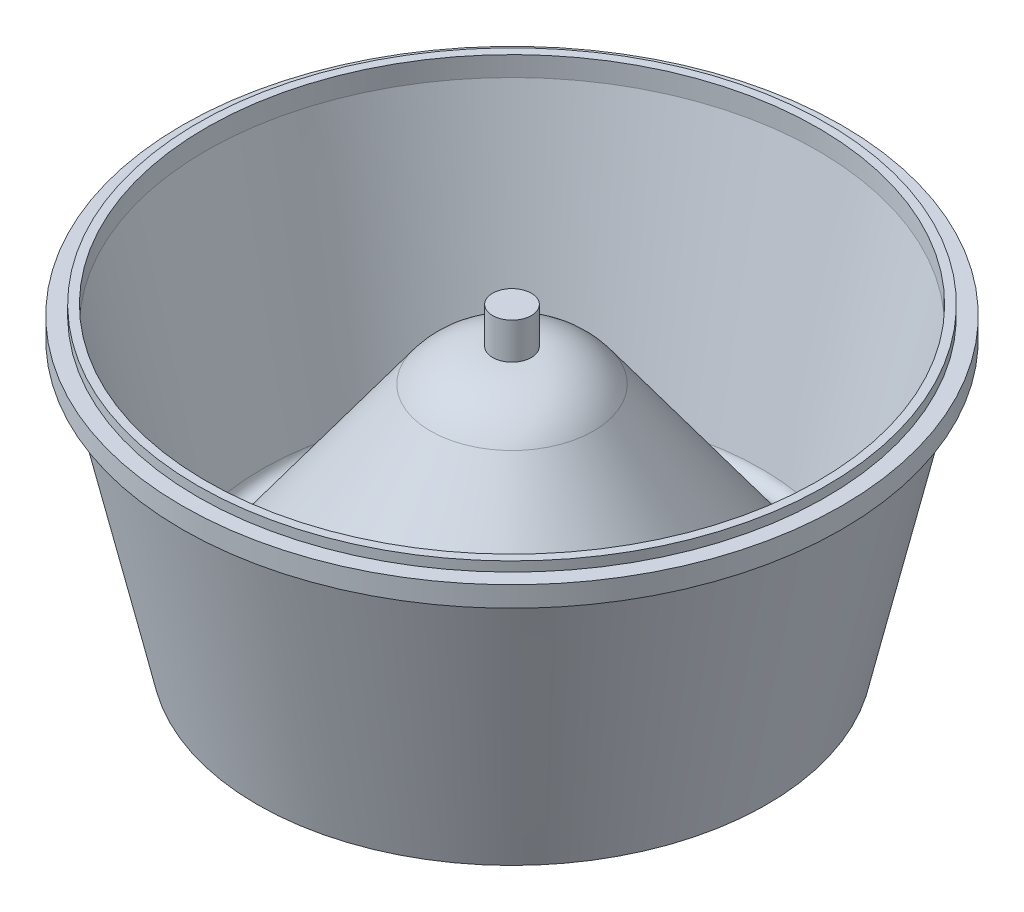
ISO-10303-21;
HEADER;
FILE_DESCRIPTION(('STEP AP214'),'2;1');
FILE_NAME('part.step','',(''),(''),'','','');
FILE_SCHEMA(('AUTOMOTIVE_DESIGN { 1 0 10303 214 1 1 1 1 }'));
ENDSEC;
DATA;
#1=APPLICATION_CONTEXT('core data for automotive mechanical design processes');
#2=APPLICATION_PROTOCOL_DEFINITION('international standard','automotive_design',2000,#1);
#3=PRODUCT_CONTEXT('',#1,'mechanical');
#4=PRODUCT('Part','Part','',(#3));
#5=PRODUCT_RELATED_PRODUCT_CATEGORY('part','',(#4));
#6=PRODUCT_DEFINITION_FORMATION('','',#4);
#7=PRODUCT_DEFINITION_CONTEXT('part definition',#1,'design');
#8=PRODUCT_DEFINITION('design','',#6,#7);
#9=PRODUCT_DEFINITION_SHAPE('','',#8);
#10=(LENGTH_UNIT() NAMED_UNIT(*) SI_UNIT(.MILLI.,.METRE.));
#11=(NAMED_UNIT(*) PLANE_ANGLE_UNIT() SI_UNIT($,.RADIAN.));
#12=(NAMED_UNIT(*) SI_UNIT($,.STERADIAN.) SOLID_ANGLE_UNIT());
#13=UNCERTAINTY_MEASURE_WITH_UNIT(LENGTH_MEASURE(1.E-05),#10,'distance_accuracy_value','');
#14=(GEOMETRIC_REPRESENTATION_CONTEXT(3) GLOBAL_UNCERTAINTY_ASSIGNED_CONTEXT((#13)) GLOBAL_UNIT_ASSIGNED_CONTEXT((#10,
#11,#12)) REPRESENTATION_CONTEXT('',''));
#15=CARTESIAN_POINT('',(0.,0.,0.));
#16=DIRECTION('',(0.,0.,1.));
#17=DIRECTION('',(1.,0.,0.));
#18=AXIS2_PLACEMENT_3D('',#15,#16,#17);
#19=CARTESIAN_POINT('',(0.,36.5219145176376,0.));
#20=DIRECTION('',(0.,-1.,0.));
#21=DIRECTION('',(0.,0.,-1.));
#22=AXIS2_PLACEMENT_3D('',#19,#20,#21);
#23=PLANE('',#22);
#24=CARTESIAN_POINT('',(0.,36.5219145176376,0.));
#25=DIRECTION('',(0.,1.,0.));
#26=DIRECTION('',(-0.010442725131449,0.,0.999945473259332));
#27=AXIS2_PLACEMENT_3D('',#24,#25,#26);
#28=CIRCLE('',#27,79.0589266179777);
#29=CARTESIAN_POINT('',(-0.825590639858945,36.5219145176376,79.0546157923885));
#30=VERTEX_POINT('',#29);
#31=EDGE_CURVE('E49',#30,#30,#28,.T.);
#32=ORIENTED_EDGE('',*,*,#31,.F.);
#33=EDGE_LOOP('',(#32));
#34=FACE_BOUND('',#33,.T.);
#35=CARTESIAN_POINT('',(0.,36.5219145176376,0.));
#36=DIRECTION('',(0.,1.,0.));
#37=DIRECTION('',(0.,0.,1.));
#38=AXIS2_PLACEMENT_3D('',#35,#36,#37);
#39=CIRCLE('',#38,81.203979415);
#40=CARTESIAN_POINT('',(0.,36.5219145176376,81.203979415));
#41=VERTEX_POINT('',#40);
#42=EDGE_CURVE('E85',#41,#41,#39,.T.);
#43=ORIENTED_EDGE('',*,*,#42,.T.);
#44=EDGE_LOOP('',(#43));
#45=FACE_BOUND('',#44,.T.);
#46=ADVANCED_FACE('F33',(#34,#45),#23,.F.);
#47=CARTESIAN_POINT('',(0.,36.5219145176376,0.));
#48=DIRECTION('',(0.,1.,0.));
#49=DIRECTION('',(-0.010442725131449,0.,0.999945473259332));
#50=AXIS2_PLACEMENT_3D('',#47,#48,#49);
#51=CIRCLE('',#50,5.00000000000001);
#52=CARTESIAN_POINT('',(-0.0522136256572501,36.5219145176376,4.99972736629666));
#53=VERTEX_POINT('',#52);
#54=EDGE_CURVE('E10',#53,#53,#51,.T.);
#55=ORIENTED_EDGE('',*,*,#54,.T.);
#56=EDGE_LOOP('',(#55));
#57=FACE_BOUND('',#56,.T.);
#58=ADVANCED_FACE('F66',(#57),#23,.F.);
#59=CARTESIAN_POINT('',(0.,-31.8607080702544,0.));
#60=DIRECTION('',(0.,1.,0.));
#61=DIRECTION('',(-0.010442725131449,0.,0.999945473259332));
#62=AXIS2_PLACEMENT_3D('',#59,#60,#61);
#63=TOROIDAL_SURFACE('',#62,61.5743761028246,2.99999999999999);
#64=CARTESIAN_POINT('',(0.,-33.625860694112,0.));
#65=DIRECTION('',(0.,1.,0.));
#66=DIRECTION('',(-0.010442725131449,0.,0.999945473259332));
#67=AXIS2_PLACEMENT_3D('',#64,#65,#66);
#68=CIRCLE('',#67,59.1486316367918);
#69=CARTESIAN_POINT('',(-0.617672902084352,-33.625860694112,59.1454064546937));
#70=VERTEX_POINT('',#69);
#71=EDGE_CURVE('E44',#70,#70,#68,.T.);
#72=ORIENTED_EDGE('',*,*,#71,.F.);
#73=EDGE_LOOP('',(#72));
#74=FACE_BOUND('',#73,.T.);
#75=CARTESIAN_POINT('',(0.,-32.5269745719057,0.));
#76=DIRECTION('',(0.,1.,0.));
#77=DIRECTION('',(-0.010442725131449,0.,0.999945473259332));
#78=AXIS2_PLACEMENT_3D('',#75,#76,#77);
#79=CIRCLE('',#78,64.4994554092328);
#80=CARTESIAN_POINT('',(-0.673550083966776,-32.5269745719057,64.4959384641544));
#81=VERTEX_POINT('',#80);
#82=EDGE_CURVE('E55',#81,#81,#79,.T.);
#83=ORIENTED_EDGE('',*,*,#82,.T.);
#84=EDGE_LOOP('',(#83));
#85=FACE_BOUND('',#84,.T.);
#86=ADVANCED_FACE('F62',(#74,#85),#63,.F.);
#87=CARTESIAN_POINT('',(0.,31.3928050348992,0.));
#88=DIRECTION('',(0.,1.,0.));
#89=DIRECTION('',(-0.010442725131449,0.,0.999945473259332));
#90=AXIS2_PLACEMENT_3D('',#87,#88,#89);
#91=CONICAL_SURFACE('',#90,79.0589266179777,0.223956285326343);
#92=ORIENTED_EDGE('',*,*,#82,.F.);
#93=EDGE_LOOP('',(#92));
#94=FACE_BOUND('',#93,.T.);
#95=CARTESIAN_POINT('',(0.,31.3928050348992,0.));
#96=DIRECTION('',(0.,1.,0.));
#97=DIRECTION('',(-0.010442725131449,0.,0.999945473259332));
#98=AXIS2_PLACEMENT_3D('',#95,#96,#97);
#99=CIRCLE('',#98,79.0589266179777);
#100=CARTESIAN_POINT('',(-0.825590639858945,31.3928050348993,79.0546157923885));
#101=VERTEX_POINT('',#100);
#102=EDGE_CURVE('E52',#101,#101,#99,.T.);
#103=ORIENTED_EDGE('',*,*,#102,.T.);
#104=EDGE_LOOP('',(#103));
#105=FACE_BOUND('',#104,.T.);
#106=ADVANCED_FACE('F65',(#94,#105),#91,.F.);
#107=CARTESIAN_POINT('',(0.,-1.22114086324985,0.));
#108=DIRECTION('',(0.,1.,0.));
#109=DIRECTION('',(-0.010442725131449,0.,0.999945473259332));
#110=AXIS2_PLACEMENT_3D('',#107,#108,#109);
#111=CYLINDRICAL_SURFACE('',#110,79.0589266179777);
#112=ORIENTED_EDGE('',*,*,#102,.F.);
#113=EDGE_LOOP('',(#112));
#114=FACE_BOUND('',#113,.T.);
#115=ORIENTED_EDGE('',*,*,#31,.T.);
#116=EDGE_LOOP('',(#115));
#117=FACE_BOUND('',#116,.T.);
#118=ADVANCED_FACE('F72',(#114,#117),#111,.F.);
#119=CARTESIAN_POINT('',(0.,-33.625860694112,0.));
#120=DIRECTION('',(0.,-1.,0.));
#121=DIRECTION('',(0.010442725131449,0.,-0.999945473259332));
#122=AXIS2_PLACEMENT_3D('',#119,#120,#121);
#123=CONICAL_SURFACE('',#122,59.1486316367918,0.629059079919701);
#124=CARTESIAN_POINT('',(0.,18.7055774452667,0.));
#125=DIRECTION('',(0.,1.,0.));
#126=DIRECTION('',(-0.010442725131449,0.,0.999945473259332));
#127=AXIS2_PLACEMENT_3D('',#124,#125,#126);
#128=CIRCLE('',#127,21.0683735405886);
#129=CARTESIAN_POINT('',(-0.220011233851065,18.7055774452667,21.0672247508482));
#130=VERTEX_POINT('',#129);
#131=EDGE_CURVE('E36',#130,#130,#128,.T.);
#132=ORIENTED_EDGE('',*,*,#131,.F.);
#133=EDGE_LOOP('',(#132));
#134=FACE_BOUND('',#133,.T.);
#135=ORIENTED_EDGE('',*,*,#71,.T.);
#136=EDGE_LOOP('',(#135));
#137=FACE_BOUND('',#136,.T.);
#138=ADVANCED_FACE('F60',(#134,#137),#123,.T.);
#139=CARTESIAN_POINT('',(0.,6.67345768639848,0.));
#140=DIRECTION('',(0.,1.,0.));
#141=DIRECTION('',(-0.010442725131449,0.,0.999945473259332));
#142=AXIS2_PLACEMENT_3D('',#139,#140,#141);
#143=DEGENERATE_TOROIDAL_SURFACE('',#142,4.5333456199246,20.4494267457277,.T.);
#144=CARTESIAN_POINT('',(0.,27.1175592298374,0.));
#145=DIRECTION('',(0.,1.,0.));
#146=DIRECTION('',(-0.010442725131449,0.,0.999945473259332));
#147=AXIS2_PLACEMENT_3D('',#144,#145,#146);
#148=CIRCLE('',#147,5.00000000000001);
#149=CARTESIAN_POINT('',(-0.0522136256572501,27.1175592298374,4.99972736629666));
#150=VERTEX_POINT('',#149);
#151=EDGE_CURVE('E47',#150,#150,#148,.T.);
#152=ORIENTED_EDGE('',*,*,#151,.F.);
#153=EDGE_LOOP('',(#152));
#154=FACE_BOUND('',#153,.T.);
#155=ORIENTED_EDGE('',*,*,#131,.T.);
#156=EDGE_LOOP('',(#155));
#157=FACE_BOUND('',#156,.T.);
#158=ADVANCED_FACE('F115',(#154,#157),#143,.T.);
#159=CARTESIAN_POINT('',(0.,-1.22114086324985,0.));
#160=DIRECTION('',(0.,1.,0.));
#161=DIRECTION('',(-0.010442725131449,0.,0.999945473259332));
#162=AXIS2_PLACEMENT_3D('',#159,#160,#161);
#163=CYLINDRICAL_SURFACE('',#162,5.00000000000001);
#164=ORIENTED_EDGE('',*,*,#54,.F.);
#165=EDGE_LOOP('',(#164));
#166=FACE_BOUND('',#165,.T.);
#167=ORIENTED_EDGE('',*,*,#151,.T.);
#168=EDGE_LOOP('',(#167));
#169=FACE_BOUND('',#168,.T.);
#170=ADVANCED_FACE('F113',(#166,#169),#163,.T.);
#171=CARTESIAN_POINT('',(-85.203979415,34.0219145176376,0.));
#172=DIRECTION('',(0.,-1.,0.));
#173=DIRECTION('',(0.,0.,-1.));
#174=AXIS2_PLACEMENT_3D('',#171,#172,#173);
#175=PLANE('',#174);
#176=CARTESIAN_POINT('',(0.,34.0219145176376,0.));
#177=DIRECTION('',(0.,1.,0.));
#178=DIRECTION('',(0.,0.,1.));
#179=AXIS2_PLACEMENT_3D('',#176,#177,#178);
#180=CIRCLE('',#179,81.203979415);
#181=CARTESIAN_POINT('',(0.,34.0219145176376,81.203979415));
#182=VERTEX_POINT('',#181);
#183=EDGE_CURVE('E87',#182,#182,#180,.T.);
#184=ORIENTED_EDGE('',*,*,#183,.F.);
#185=EDGE_LOOP('',(#184));
#186=FACE_BOUND('',#185,.T.);
#187=CARTESIAN_POINT('',(0.,34.0219145176376,0.));
#188=DIRECTION('',(0.,1.,0.));
#189=DIRECTION('',(0.,0.,1.));
#190=AXIS2_PLACEMENT_3D('',#187,#188,#189);
#191=CIRCLE('',#190,85.203979415);
#192=CARTESIAN_POINT('',(0.,34.0219145176376,85.203979415));
#193=VERTEX_POINT('',#192);
#194=EDGE_CURVE('E90',#193,#193,#191,.T.);
#195=ORIENTED_EDGE('',*,*,#194,.T.);
#196=EDGE_LOOP('',(#195));
#197=FACE_BOUND('',#196,.T.);
#198=ADVANCED_FACE('F143',(#186,#197),#175,.F.);
#199=CARTESIAN_POINT('',(0.,0.,0.));
#200=DIRECTION('',(0.,1.,0.));
#201=DIRECTION('',(0.,0.,1.));
#202=AXIS2_PLACEMENT_3D('',#199,#200,#201);
#203=CYLINDRICAL_SURFACE('',#202,81.203979415);
#204=ORIENTED_EDGE('',*,*,#42,.F.);
#205=EDGE_LOOP('',(#204));
#206=FACE_BOUND('',#205,.T.);
#207=ORIENTED_EDGE('',*,*,#183,.T.);
#208=EDGE_LOOP('',(#207));
#209=FACE_BOUND('',#208,.T.);
#210=ADVANCED_FACE('F145',(#206,#209),#203,.T.);
#211=CARTESIAN_POINT('',(0.,21.3528051327785,0.));
#212=DIRECTION('',(0.,-1.,0.));
#213=DIRECTION('',(0.,0.,-1.));
#214=AXIS2_PLACEMENT_3D('',#211,#212,#213);
#215=PLANE('',#214);
#216=CARTESIAN_POINT('',(0.,21.3528051327785,0.));
#217=DIRECTION('',(0.,1.,0.));
#218=DIRECTION('',(0.,0.,1.));
#219=AXIS2_PLACEMENT_3D('',#216,#217,#218);
#220=CIRCLE('',#219,7.47114386286857);
#221=CARTESIAN_POINT('',(0.,21.3528051327785,-7.47114386286858));
#222=VERTEX_POINT('',#221);
#223=EDGE_CURVE('E98',#222,#222,#220,.T.);
#224=ORIENTED_EDGE('',*,*,#223,.F.);
#225=EDGE_LOOP('',(#224));
#226=FACE_BOUND('',#225,.T.);
#227=ADVANCED_FACE('F152',(#226),#215,.T.);
#228=CARTESIAN_POINT('',(0.,-42.5,0.));
#229=DIRECTION('',(0.,-1.,0.));
#230=DIRECTION('',(0.,0.,-1.));
#231=AXIS2_PLACEMENT_3D('',#228,#229,#230);
#232=CONICAL_SURFACE('',#231,48.5810450737176,0.572020564915325);
#233=CARTESIAN_POINT('',(0.,-42.5,0.));
#234=DIRECTION('',(0.,1.,0.));
#235=DIRECTION('',(0.,0.,1.));
#236=AXIS2_PLACEMENT_3D('',#233,#234,#235);
#237=CIRCLE('',#236,48.5810450737176);
#238=CARTESIAN_POINT('',(0.,-42.5,-48.5810450737176));
#239=VERTEX_POINT('',#238);
#240=EDGE_CURVE('E95',#239,#239,#237,.T.);
#241=CARTESIAN_POINT('',(0.,21.3528051327785,-7.47114386286858));
#242=CARTESIAN_POINT('',(0.,20.6876717459787,-7.8993720004816));
#243=CARTESIAN_POINT('',(0.,20.0225383591789,-8.32760013809461));
#244=CARTESIAN_POINT('',(0.,18.6922715855794,-9.18405641332063));
#245=CARTESIAN_POINT('',(0.,18.0271381987796,-9.61228455093363));
#246=CARTESIAN_POINT('',(0.,16.69687142518,-10.4687408261597));
#247=CARTESIAN_POINT('',(0.,16.0317380383803,-10.8969689637727));
#248=CARTESIAN_POINT('',(0.,14.7014712647807,-11.7534252389987));
#249=CARTESIAN_POINT('',(0.,14.0363378779809,-12.1816533766117));
#250=CARTESIAN_POINT('',(0.,12.7060711043814,-13.0381096518377));
#251=CARTESIAN_POINT('',(0.,12.0409377175816,-13.4663377894507));
#252=CARTESIAN_POINT('',(0.,10.7106709439821,-14.3227940646768));
#253=CARTESIAN_POINT('',(0.,10.0455375571823,-14.7510222022898));
#254=CARTESIAN_POINT('',(0.,8.71527078358273,-15.6074784775158));
#255=CARTESIAN_POINT('',(0.,8.05013739678296,-16.0357066151288));
#256=CARTESIAN_POINT('',(0.,6.71987062318341,-16.8921628903548));
#257=CARTESIAN_POINT('',(0.,6.05473723638363,-17.3203910279678));
#258=CARTESIAN_POINT('',(0.,4.72447046278408,-18.1768473031939));
#259=CARTESIAN_POINT('',(0.,4.0593370759843,-18.6050754408069));
#260=CARTESIAN_POINT('',(0.,2.72907030238475,-19.4615317160329));
#261=CARTESIAN_POINT('',(0.,2.06393691558498,-19.8897598536459));
#262=CARTESIAN_POINT('',(0.,0.733670141985425,-20.7462161288719));
#263=CARTESIAN_POINT('',(0.,0.0685367551856486,-21.1744442664849));
#264=CARTESIAN_POINT('',(0.,-1.2617300184139,-22.030900541711));
#265=CARTESIAN_POINT('',(0.,-1.92686340521368,-22.459128679324));
#266=CARTESIAN_POINT('',(0.,-3.25713017881323,-23.31558495455));
#267=CARTESIAN_POINT('',(0.,-3.92226356561301,-23.743813092163));
#268=CARTESIAN_POINT('',(0.,-5.25253033921256,-24.600269367389));
#269=CARTESIAN_POINT('',(0.,-5.91766372601233,-25.028497505002));
#270=CARTESIAN_POINT('',(0.,-7.24793049961188,-25.8849537802281));
#271=CARTESIAN_POINT('',(0.,-7.91306388641166,-26.3131819178411));
#272=CARTESIAN_POINT('',(0.,-9.24333066001121,-27.1696381930671));
#273=CARTESIAN_POINT('',(0.,-9.90846404681099,-27.5978663306801));
#274=CARTESIAN_POINT('',(0.,-11.2387308204105,-28.4543226059061));
#275=CARTESIAN_POINT('',(0.,-11.9038642072103,-28.8825507435191));
#276=CARTESIAN_POINT('',(0.,-13.2341309808099,-29.7390070187452));
#277=CARTESIAN_POINT('',(0.,-13.8992643676096,-30.1672351563582));
#278=CARTESIAN_POINT('',(0.,-15.2295311412092,-31.0236914315842));
#279=CARTESIAN_POINT('',(0.,-15.894664528009,-31.4519195691972));
#280=CARTESIAN_POINT('',(0.,-17.2249313016085,-32.3083758444232));
#281=CARTESIAN_POINT('',(0.,-17.8900646884083,-32.7366039820362));
#282=CARTESIAN_POINT('',(0.,-19.2203314620078,-33.5930602572623));
#283=CARTESIAN_POINT('',(0.,-19.8854648488076,-34.0212883948753));
#284=CARTESIAN_POINT('',(0.,-21.2157316224072,-34.8777446701013));
#285=CARTESIAN_POINT('',(0.,-21.8808650092069,-35.3059728077143));
#286=CARTESIAN_POINT('',(0.,-23.2111317828065,-36.1624290829403));
#287=CARTESIAN_POINT('',(0.,-23.8762651696063,-36.5906572205533));
#288=CARTESIAN_POINT('',(0.,-25.2065319432058,-37.4471134957794));
#289=CARTESIAN_POINT('',(0.,-25.8716653300056,-37.8753416333924));
#290=CARTESIAN_POINT('',(0.,-27.2019321036052,-38.7317979086184));
#291=CARTESIAN_POINT('',(0.,-27.8670654904049,-39.1600260462314));
#292=CARTESIAN_POINT('',(0.,-29.1973322640045,-40.0164823214574));
#293=CARTESIAN_POINT('',(0.,-29.8624656508043,-40.4447104590704));
#294=CARTESIAN_POINT('',(0.,-31.1927324244038,-41.3011667342965));
#295=CARTESIAN_POINT('',(0.,-31.8578658112036,-41.7293948719095));
#296=CARTESIAN_POINT('',(0.,-33.1881325848031,-42.5858511471355));
#297=CARTESIAN_POINT('',(0.,-33.8532659716029,-43.0140792847485));
#298=CARTESIAN_POINT('',(0.,-35.1835327452025,-43.8705355599745));
#299=CARTESIAN_POINT('',(0.,-35.8486661320022,-44.2987636975875));
#300=CARTESIAN_POINT('',(0.,-37.1789329056018,-45.1552199728136));
#301=CARTESIAN_POINT('',(0.,-37.8440662924016,-45.5834481104266));
#302=CARTESIAN_POINT('',(0.,-39.1743330660011,-46.4399043856526));
#303=CARTESIAN_POINT('',(0.,-39.8394664528009,-46.8681325232656));
#304=CARTESIAN_POINT('',(0.,-41.1697332264004,-47.7245887984916));
#305=CARTESIAN_POINT('',(0.,-41.8348666132002,-48.1528169361046));
#306=CARTESIAN_POINT('',(0.,-42.5,-48.5810450737176));
#307=B_SPLINE_CURVE_WITH_KNOTS('',3,(#241,#242,#243,#244,#245,#246,#247,#248,#249,#250,#251,
#252,#253,#254,#255,#256,#257,#258,#259,#260,#261,#262,#263,#264,#265,#266,#267,#268,#269,#270,
#271,#272,#273,#274,#275,#276,#277,#278,#279,#280,#281,#282,#283,#284,#285,#286,#287,#288,#289,
#290,#291,#292,#293,#294,#295,#296,#297,#298,#299,#300,#301,#302,#303,#304,#305,#306),
.UNSPECIFIED.,.F.,.F.,(4,2,2,2,2,2,2,2,2,2,2,2,2,2,2,2,2,2,2,2,2,2,2,2,2,2,2,2,2,2,2,2,4),(0.,
2.37319106704733,4.74638213409465,7.11957320114198,9.49276426818931,11.8659553352366,
14.239146402284,16.6123374693313,18.9855285363786,21.3587196034259,23.7319106704733,
26.1051017375206,28.4782928045679,30.8514838716153,33.2246749386626,35.5978660057099,
37.9710570727572,40.3442481398046,42.7174392068519,45.0906302738992,47.4638213409466,
49.8370124079939,52.2102034750412,54.5833945420885,56.9565856091359,59.3297766761832,
61.7029677432305,64.0761588102779,66.4493498773252,68.8225409443725,71.1957320114198,
73.5689230784672,75.9421141455145),.UNSPECIFIED.);
#308=EDGE_CURVE('BSEAM129',#222,#239,#307,.T.);
#309=ORIENTED_EDGE('',*,*,#223,.T.);
#310=ORIENTED_EDGE('',*,*,#240,.F.);
#311=ORIENTED_EDGE('',*,*,#308,.T.);
#312=ORIENTED_EDGE('',*,*,#308,.F.);
#313=EDGE_LOOP('',(#309,#311,#310,#312));
#314=FACE_BOUND('',#313,.T.);
#315=ADVANCED_FACE('F129',(#314),#232,.F.);
#316=CARTESIAN_POINT('',(0.,-42.5,-85.203979415));
#317=DIRECTION('',(0.,1.,0.));
#318=DIRECTION('',(0.,0.,1.));
#319=AXIS2_PLACEMENT_3D('',#316,#317,#318);
#320=PLANE('',#319);
#321=CARTESIAN_POINT('',(0.,-42.5,0.));
#322=DIRECTION('',(0.,1.,0.));
#323=DIRECTION('',(0.,0.,1.));
#324=AXIS2_PLACEMENT_3D('',#321,#322,#323);
#325=CIRCLE('',#324,65.8434158050608);
#326=CARTESIAN_POINT('',(0.,-42.5,65.8434158050608));
#327=VERTEX_POINT('',#326);
#328=EDGE_CURVE('E101',#327,#327,#325,.T.);
#329=ORIENTED_EDGE('',*,*,#328,.F.);
#330=EDGE_LOOP('',(#329));
#331=FACE_BOUND('',#330,.T.);
#332=ORIENTED_EDGE('',*,*,#240,.T.);
#333=EDGE_LOOP('',(#332));
#334=FACE_BOUND('',#333,.T.);
#335=ADVANCED_FACE('F126',(#331,#334),#320,.F.);
#336=CARTESIAN_POINT('',(0.,28.7475037971817,0.));
#337=DIRECTION('',(0.,1.,0.));
#338=DIRECTION('',(0.,0.,1.));
#339=AXIS2_PLACEMENT_3D('',#336,#337,#338);
#340=CONICAL_SURFACE('',#339,82.0719758315659,0.223956285326343);
#341=ORIENTED_EDGE('',*,*,#328,.T.);
#342=EDGE_LOOP('',(#341));
#343=FACE_BOUND('',#342,.T.);
#344=CARTESIAN_POINT('',(0.,28.7475037971817,0.));
#345=DIRECTION('',(0.,1.,0.));
#346=DIRECTION('',(0.,0.,1.));
#347=AXIS2_PLACEMENT_3D('',#344,#345,#346);
#348=CIRCLE('',#347,82.0719758315659);
#349=CARTESIAN_POINT('',(0.,28.7475037971817,82.0719758315659));
#350=VERTEX_POINT('',#349);
#351=EDGE_CURVE('E104',#350,#350,#348,.T.);
#352=ORIENTED_EDGE('',*,*,#351,.F.);
#353=EDGE_LOOP('',(#352));
#354=FACE_BOUND('',#353,.T.);
#355=ADVANCED_FACE('F128',(#343,#354),#340,.T.);
#356=CARTESIAN_POINT('',(0.,28.7475037971817,-85.203979415));
#357=DIRECTION('',(0.,-1.,0.));
#358=DIRECTION('',(0.,0.,-1.));
#359=AXIS2_PLACEMENT_3D('',#356,#357,#358);
#360=PLANE('',#359);
#361=ORIENTED_EDGE('',*,*,#351,.T.);
#362=EDGE_LOOP('',(#361));
#363=FACE_BOUND('',#362,.T.);
#364=CARTESIAN_POINT('',(0.,28.7475037971817,0.));
#365=DIRECTION('',(0.,1.,0.));
#366=DIRECTION('',(0.,0.,1.));
#367=AXIS2_PLACEMENT_3D('',#364,#365,#366);
#368=CIRCLE('',#367,85.203979415);
#369=CARTESIAN_POINT('',(0.,28.7475037971817,85.203979415));
#370=VERTEX_POINT('',#369);
#371=EDGE_CURVE('E106',#370,#370,#368,.T.);
#372=ORIENTED_EDGE('',*,*,#371,.F.);
#373=EDGE_LOOP('',(#372));
#374=FACE_BOUND('',#373,.T.);
#375=ADVANCED_FACE('F133',(#363,#374),#360,.T.);
#376=CARTESIAN_POINT('',(0.,42.5,0.));
#377=DIRECTION('',(0.,1.,0.));
#378=DIRECTION('',(0.,0.,1.));
#379=AXIS2_PLACEMENT_3D('',#376,#377,#378);
#380=CYLINDRICAL_SURFACE('',#379,85.203979415);
#381=ORIENTED_EDGE('',*,*,#194,.F.);
#382=EDGE_LOOP('',(#381));
#383=FACE_BOUND('',#382,.T.);
#384=ORIENTED_EDGE('',*,*,#371,.T.);
#385=EDGE_LOOP('',(#384));
#386=FACE_BOUND('',#385,.T.);
#387=ADVANCED_FACE('F131',(#383,#386),#380,.T.);
#388=CLOSED_SHELL('',(#46,#58,#86,#106,#118,#138,#158,#170,#198,#210,#227,#315,#335,#355,#375,#387));
#389=MANIFOLD_SOLID_BREP('B2',#388);
#390=ADVANCED_BREP_SHAPE_REPRESENTATION('',(#18,#389),#14);
#391=SHAPE_DEFINITION_REPRESENTATION(#9,#390);
ENDSEC;
END-ISO-10303-21;
